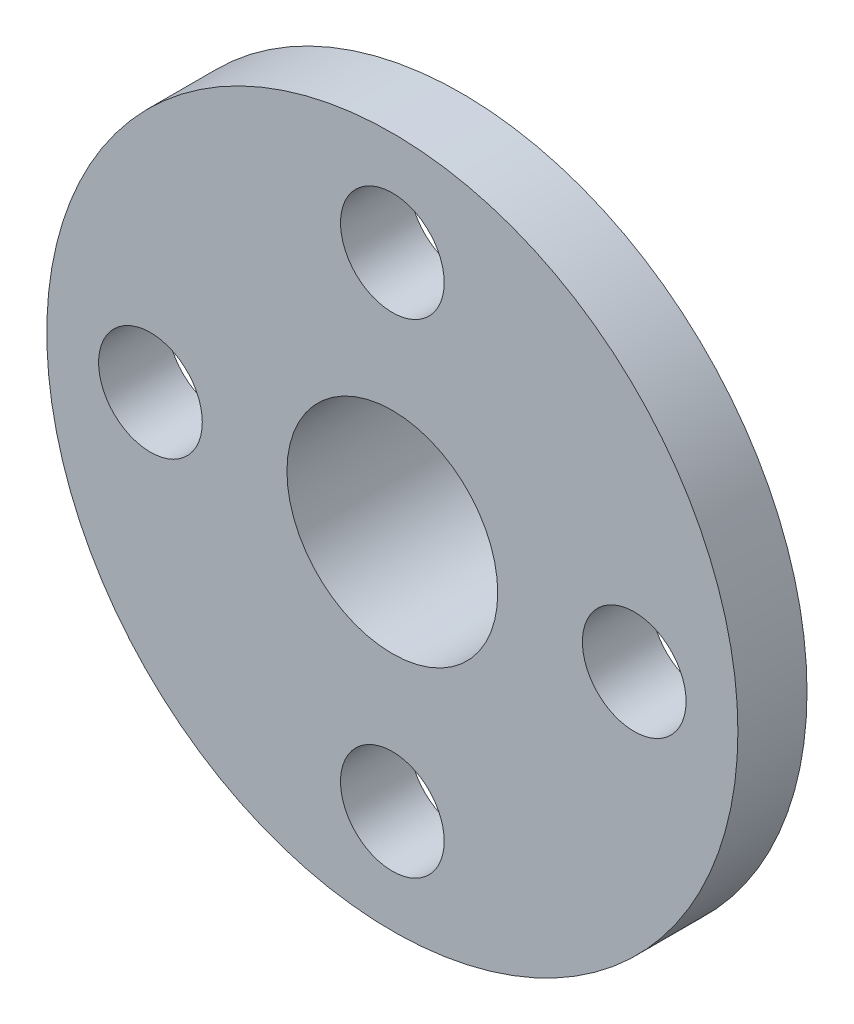
ISO-10303-21;
HEADER;
FILE_DESCRIPTION(('STEP AP214'),'2;1');
FILE_NAME('part.step','',(''),(''),'','','');
FILE_SCHEMA(('AUTOMOTIVE_DESIGN { 1 0 10303 214 1 1 1 1 }'));
ENDSEC;
DATA;
#1=APPLICATION_CONTEXT('core data for automotive mechanical design processes');
#2=APPLICATION_PROTOCOL_DEFINITION('international standard','automotive_design',2000,#1);
#3=PRODUCT_CONTEXT('',#1,'mechanical');
#4=PRODUCT('Part','Part','',(#3));
#5=PRODUCT_RELATED_PRODUCT_CATEGORY('part','',(#4));
#6=PRODUCT_DEFINITION_FORMATION('','',#4);
#7=PRODUCT_DEFINITION_CONTEXT('part definition',#1,'design');
#8=PRODUCT_DEFINITION('design','',#6,#7);
#9=PRODUCT_DEFINITION_SHAPE('','',#8);
#10=(LENGTH_UNIT() NAMED_UNIT(*) SI_UNIT(.MILLI.,.METRE.));
#11=(NAMED_UNIT(*) PLANE_ANGLE_UNIT() SI_UNIT($,.RADIAN.));
#12=(NAMED_UNIT(*) SI_UNIT($,.STERADIAN.) SOLID_ANGLE_UNIT());
#13=UNCERTAINTY_MEASURE_WITH_UNIT(LENGTH_MEASURE(1.E-05),#10,'distance_accuracy_value','');
#14=(GEOMETRIC_REPRESENTATION_CONTEXT(3) GLOBAL_UNCERTAINTY_ASSIGNED_CONTEXT((#13)) GLOBAL_UNIT_ASSIGNED_CONTEXT((#10,
#11,#12)) REPRESENTATION_CONTEXT('',''));
#15=CARTESIAN_POINT('',(0.,0.,0.));
#16=DIRECTION('',(0.,0.,1.));
#17=DIRECTION('',(1.,0.,0.));
#18=AXIS2_PLACEMENT_3D('',#15,#16,#17);
#19=CARTESIAN_POINT('',(0.,0.,2.));
#20=DIRECTION('',(0.,0.,1.));
#21=DIRECTION('',(1.,0.,0.));
#22=AXIS2_PLACEMENT_3D('',#19,#20,#21);
#23=PLANE('',#22);
#24=CARTESIAN_POINT('',(-7.,0.,2.));
#25=DIRECTION('',(0.,0.,1.));
#26=DIRECTION('',(1.,0.,0.));
#27=AXIS2_PLACEMENT_3D('',#24,#25,#26);
#28=CIRCLE('',#27,1.5);
#29=CARTESIAN_POINT('',(-5.5,0.,2.));
#30=VERTEX_POINT('',#29);
#31=EDGE_CURVE('E64',#30,#30,#28,.T.);
#32=ORIENTED_EDGE('',*,*,#31,.F.);
#33=EDGE_LOOP('',(#32));
#34=FACE_BOUND('',#33,.T.);
#35=CARTESIAN_POINT('',(7.,0.,2.));
#36=DIRECTION('',(0.,0.,1.));
#37=DIRECTION('',(1.,0.,0.));
#38=AXIS2_PLACEMENT_3D('',#35,#36,#37);
#39=CIRCLE('',#38,1.5);
#40=CARTESIAN_POINT('',(8.5,0.,2.));
#41=VERTEX_POINT('',#40);
#42=EDGE_CURVE('E135',#41,#41,#39,.T.);
#43=ORIENTED_EDGE('',*,*,#42,.F.);
#44=EDGE_LOOP('',(#43));
#45=FACE_BOUND('',#44,.T.);
#46=CARTESIAN_POINT('',(0.,-7.,2.));
#47=DIRECTION('',(0.,0.,1.));
#48=DIRECTION('',(1.,0.,0.));
#49=AXIS2_PLACEMENT_3D('',#46,#47,#48);
#50=CIRCLE('',#49,1.5);
#51=CARTESIAN_POINT('',(1.5,-7.,2.));
#52=VERTEX_POINT('',#51);
#53=EDGE_CURVE('E133',#52,#52,#50,.T.);
#54=ORIENTED_EDGE('',*,*,#53,.F.);
#55=EDGE_LOOP('',(#54));
#56=FACE_BOUND('',#55,.T.);
#57=CARTESIAN_POINT('',(0.,7.,2.));
#58=DIRECTION('',(0.,0.,1.));
#59=DIRECTION('',(1.,0.,0.));
#60=AXIS2_PLACEMENT_3D('',#57,#58,#59);
#61=CIRCLE('',#60,1.5);
#62=CARTESIAN_POINT('',(1.5,7.,2.));
#63=VERTEX_POINT('',#62);
#64=EDGE_CURVE('E81',#63,#63,#61,.T.);
#65=ORIENTED_EDGE('',*,*,#64,.F.);
#66=EDGE_LOOP('',(#65));
#67=FACE_BOUND('',#66,.T.);
#68=CARTESIAN_POINT('',(0.,0.,2.));
#69=DIRECTION('',(0.,0.,1.));
#70=DIRECTION('',(1.,0.,0.));
#71=AXIS2_PLACEMENT_3D('',#68,#69,#70);
#72=CIRCLE('',#71,10.);
#73=CARTESIAN_POINT('',(10.,0.,2.));
#74=VERTEX_POINT('',#73);
#75=EDGE_CURVE('E10',#74,#74,#72,.T.);
#76=ORIENTED_EDGE('',*,*,#75,.T.);
#77=EDGE_LOOP('',(#76));
#78=FACE_BOUND('',#77,.T.);
#79=CARTESIAN_POINT('',(0.,0.,2.));
#80=DIRECTION('',(0.,0.,1.));
#81=DIRECTION('',(1.,0.,0.));
#82=AXIS2_PLACEMENT_3D('',#79,#80,#81);
#83=CIRCLE('',#82,3.05);
#84=CARTESIAN_POINT('',(3.05,0.,2.));
#85=VERTEX_POINT('',#84);
#86=EDGE_CURVE('E53',#85,#85,#83,.T.);
#87=ORIENTED_EDGE('',*,*,#86,.F.);
#88=EDGE_LOOP('',(#87));
#89=FACE_BOUND('',#88,.T.);
#90=ADVANCED_FACE('F41',(#34,#45,#56,#67,#78,#89),#23,.T.);
#91=CARTESIAN_POINT('',(0.,0.,0.));
#92=DIRECTION('',(0.,0.,1.));
#93=DIRECTION('',(1.,0.,0.));
#94=AXIS2_PLACEMENT_3D('',#91,#92,#93);
#95=PLANE('',#94);
#96=CARTESIAN_POINT('',(-7.,0.,0.));
#97=DIRECTION('',(0.,0.,1.));
#98=DIRECTION('',(1.,0.,0.));
#99=AXIS2_PLACEMENT_3D('',#96,#97,#98);
#100=CIRCLE('',#99,1.5);
#101=CARTESIAN_POINT('',(-5.5,0.,0.));
#102=VERTEX_POINT('',#101);
#103=EDGE_CURVE('E44',#102,#102,#100,.F.);
#104=ORIENTED_EDGE('',*,*,#103,.F.);
#105=EDGE_LOOP('',(#104));
#106=FACE_BOUND('',#105,.T.);
#107=CARTESIAN_POINT('',(7.,0.,0.));
#108=DIRECTION('',(0.,0.,1.));
#109=DIRECTION('',(1.,0.,0.));
#110=AXIS2_PLACEMENT_3D('',#107,#108,#109);
#111=CIRCLE('',#110,1.5);
#112=CARTESIAN_POINT('',(8.5,0.,0.));
#113=VERTEX_POINT('',#112);
#114=EDGE_CURVE('E63',#113,#113,#111,.F.);
#115=ORIENTED_EDGE('',*,*,#114,.F.);
#116=EDGE_LOOP('',(#115));
#117=FACE_BOUND('',#116,.T.);
#118=CARTESIAN_POINT('',(0.,-7.,0.));
#119=DIRECTION('',(0.,0.,1.));
#120=DIRECTION('',(1.,0.,0.));
#121=AXIS2_PLACEMENT_3D('',#118,#119,#120);
#122=CIRCLE('',#121,1.5);
#123=CARTESIAN_POINT('',(1.5,-7.,0.));
#124=VERTEX_POINT('',#123);
#125=EDGE_CURVE('E65',#124,#124,#122,.F.);
#126=ORIENTED_EDGE('',*,*,#125,.F.);
#127=EDGE_LOOP('',(#126));
#128=FACE_BOUND('',#127,.T.);
#129=CARTESIAN_POINT('',(0.,7.,0.));
#130=DIRECTION('',(0.,0.,1.));
#131=DIRECTION('',(1.,0.,0.));
#132=AXIS2_PLACEMENT_3D('',#129,#130,#131);
#133=CIRCLE('',#132,1.5);
#134=CARTESIAN_POINT('',(1.5,7.,0.));
#135=VERTEX_POINT('',#134);
#136=EDGE_CURVE('E56',#135,#135,#133,.F.);
#137=ORIENTED_EDGE('',*,*,#136,.F.);
#138=EDGE_LOOP('',(#137));
#139=FACE_BOUND('',#138,.T.);
#140=CARTESIAN_POINT('',(0.,0.,0.));
#141=DIRECTION('',(0.,0.,1.));
#142=DIRECTION('',(1.,0.,0.));
#143=AXIS2_PLACEMENT_3D('',#140,#141,#142);
#144=CIRCLE('',#143,4.5);
#145=CARTESIAN_POINT('',(4.5,0.,0.));
#146=VERTEX_POINT('',#145);
#147=EDGE_CURVE('E76',#146,#146,#144,.T.);
#148=ORIENTED_EDGE('',*,*,#147,.T.);
#149=EDGE_LOOP('',(#148));
#150=FACE_BOUND('',#149,.T.);
#151=CARTESIAN_POINT('',(0.,0.,0.));
#152=DIRECTION('',(0.,0.,1.));
#153=DIRECTION('',(1.,0.,0.));
#154=AXIS2_PLACEMENT_3D('',#151,#152,#153);
#155=CIRCLE('',#154,10.);
#156=CARTESIAN_POINT('',(10.,0.,0.));
#157=VERTEX_POINT('',#156);
#158=EDGE_CURVE('E47',#157,#157,#155,.T.);
#159=ORIENTED_EDGE('',*,*,#158,.F.);
#160=EDGE_LOOP('',(#159));
#161=FACE_BOUND('',#160,.T.);
#162=ADVANCED_FACE('F94',(#106,#117,#128,#139,#150,#161),#95,.F.);
#163=CARTESIAN_POINT('',(0.,0.,2.));
#164=DIRECTION('',(0.,0.,-1.));
#165=DIRECTION('',(-1.,0.,0.));
#166=AXIS2_PLACEMENT_3D('',#163,#164,#165);
#167=CYLINDRICAL_SURFACE('',#166,10.);
#168=ORIENTED_EDGE('',*,*,#75,.F.);
#169=EDGE_LOOP('',(#168));
#170=FACE_BOUND('',#169,.T.);
#171=ORIENTED_EDGE('',*,*,#158,.T.);
#172=EDGE_LOOP('',(#171));
#173=FACE_BOUND('',#172,.T.);
#174=ADVANCED_FACE('F43',(#170,#173),#167,.T.);
#175=CARTESIAN_POINT('',(0.,0.,2.));
#176=DIRECTION('',(0.,0.,-1.));
#177=DIRECTION('',(-1.,0.,0.));
#178=AXIS2_PLACEMENT_3D('',#175,#176,#177);
#179=CYLINDRICAL_SURFACE('',#178,3.05);
#180=ORIENTED_EDGE('',*,*,#86,.T.);
#181=EDGE_LOOP('',(#180));
#182=FACE_BOUND('',#181,.T.);
#183=CARTESIAN_POINT('',(0.,0.,-2.5));
#184=DIRECTION('',(0.,0.,1.));
#185=DIRECTION('',(1.,0.,0.));
#186=AXIS2_PLACEMENT_3D('',#183,#184,#185);
#187=CIRCLE('',#186,3.05);
#188=CARTESIAN_POINT('',(3.05,0.,-2.5));
#189=VERTEX_POINT('',#188);
#190=EDGE_CURVE('E67',#189,#189,#187,.T.);
#191=ORIENTED_EDGE('',*,*,#190,.F.);
#192=EDGE_LOOP('',(#191));
#193=FACE_BOUND('',#192,.T.);
#194=ADVANCED_FACE('F89',(#182,#193),#179,.F.);
#195=CARTESIAN_POINT('',(0.,0.,-2.5));
#196=DIRECTION('',(0.,0.,1.));
#197=DIRECTION('',(1.,0.,0.));
#198=AXIS2_PLACEMENT_3D('',#195,#196,#197);
#199=PLANE('',#198);
#200=CARTESIAN_POINT('',(0.,0.,-2.5));
#201=DIRECTION('',(0.,0.,1.));
#202=DIRECTION('',(1.,0.,0.));
#203=AXIS2_PLACEMENT_3D('',#200,#201,#202);
#204=CIRCLE('',#203,4.5);
#205=CARTESIAN_POINT('',(4.5,0.,-2.5));
#206=VERTEX_POINT('',#205);
#207=EDGE_CURVE('E74',#206,#206,#204,.T.);
#208=ORIENTED_EDGE('',*,*,#207,.F.);
#209=EDGE_LOOP('',(#208));
#210=FACE_BOUND('',#209,.T.);
#211=ORIENTED_EDGE('',*,*,#190,.T.);
#212=EDGE_LOOP('',(#211));
#213=FACE_BOUND('',#212,.T.);
#214=ADVANCED_FACE('F110',(#210,#213),#199,.F.);
#215=CARTESIAN_POINT('',(0.,0.,0.));
#216=DIRECTION('',(0.,0.,-1.));
#217=DIRECTION('',(-1.,0.,0.));
#218=AXIS2_PLACEMENT_3D('',#215,#216,#217);
#219=CYLINDRICAL_SURFACE('',#218,4.5);
#220=ORIENTED_EDGE('',*,*,#147,.F.);
#221=EDGE_LOOP('',(#220));
#222=FACE_BOUND('',#221,.T.);
#223=ORIENTED_EDGE('',*,*,#207,.T.);
#224=EDGE_LOOP('',(#223));
#225=FACE_BOUND('',#224,.T.);
#226=ADVANCED_FACE('F107',(#222,#225),#219,.T.);
#227=CARTESIAN_POINT('',(0.,7.,2.));
#228=DIRECTION('',(0.,0.,-1.));
#229=DIRECTION('',(-1.,0.,0.));
#230=AXIS2_PLACEMENT_3D('',#227,#228,#229);
#231=CYLINDRICAL_SURFACE('',#230,1.5);
#232=ORIENTED_EDGE('',*,*,#64,.T.);
#233=EDGE_LOOP('',(#232));
#234=FACE_BOUND('',#233,.T.);
#235=ORIENTED_EDGE('',*,*,#136,.T.);
#236=EDGE_LOOP('',(#235));
#237=FACE_BOUND('',#236,.T.);
#238=ADVANCED_FACE('F109',(#234,#237),#231,.F.);
#239=CARTESIAN_POINT('',(0.,-7.,2.));
#240=DIRECTION('',(0.,0.,-1.));
#241=DIRECTION('',(-1.,0.,0.));
#242=AXIS2_PLACEMENT_3D('',#239,#240,#241);
#243=CYLINDRICAL_SURFACE('',#242,1.5);
#244=ORIENTED_EDGE('',*,*,#53,.T.);
#245=EDGE_LOOP('',(#244));
#246=FACE_BOUND('',#245,.T.);
#247=ORIENTED_EDGE('',*,*,#125,.T.);
#248=EDGE_LOOP('',(#247));
#249=FACE_BOUND('',#248,.T.);
#250=ADVANCED_FACE('F120',(#246,#249),#243,.F.);
#251=CARTESIAN_POINT('',(7.,0.,2.));
#252=DIRECTION('',(0.,0.,-1.));
#253=DIRECTION('',(-1.,0.,0.));
#254=AXIS2_PLACEMENT_3D('',#251,#252,#253);
#255=CYLINDRICAL_SURFACE('',#254,1.5);
#256=ORIENTED_EDGE('',*,*,#42,.T.);
#257=EDGE_LOOP('',(#256));
#258=FACE_BOUND('',#257,.T.);
#259=ORIENTED_EDGE('',*,*,#114,.T.);
#260=EDGE_LOOP('',(#259));
#261=FACE_BOUND('',#260,.T.);
#262=ADVANCED_FACE('F124',(#258,#261),#255,.F.);
#263=CARTESIAN_POINT('',(-7.,0.,2.));
#264=DIRECTION('',(0.,0.,-1.));
#265=DIRECTION('',(-1.,0.,0.));
#266=AXIS2_PLACEMENT_3D('',#263,#264,#265);
#267=CYLINDRICAL_SURFACE('',#266,1.5);
#268=ORIENTED_EDGE('',*,*,#31,.T.);
#269=EDGE_LOOP('',(#268));
#270=FACE_BOUND('',#269,.T.);
#271=ORIENTED_EDGE('',*,*,#103,.T.);
#272=EDGE_LOOP('',(#271));
#273=FACE_BOUND('',#272,.T.);
#274=ADVANCED_FACE('F122',(#270,#273),#267,.F.);
#275=CLOSED_SHELL('',(#90,#162,#174,#194,#214,#226,#238,#250,#262,#274));
#276=MANIFOLD_SOLID_BREP('B2',#275);
#277=ADVANCED_BREP_SHAPE_REPRESENTATION('',(#18,#276),#14);
#278=SHAPE_DEFINITION_REPRESENTATION(#9,#277);
ENDSEC;
END-ISO-10303-21;
